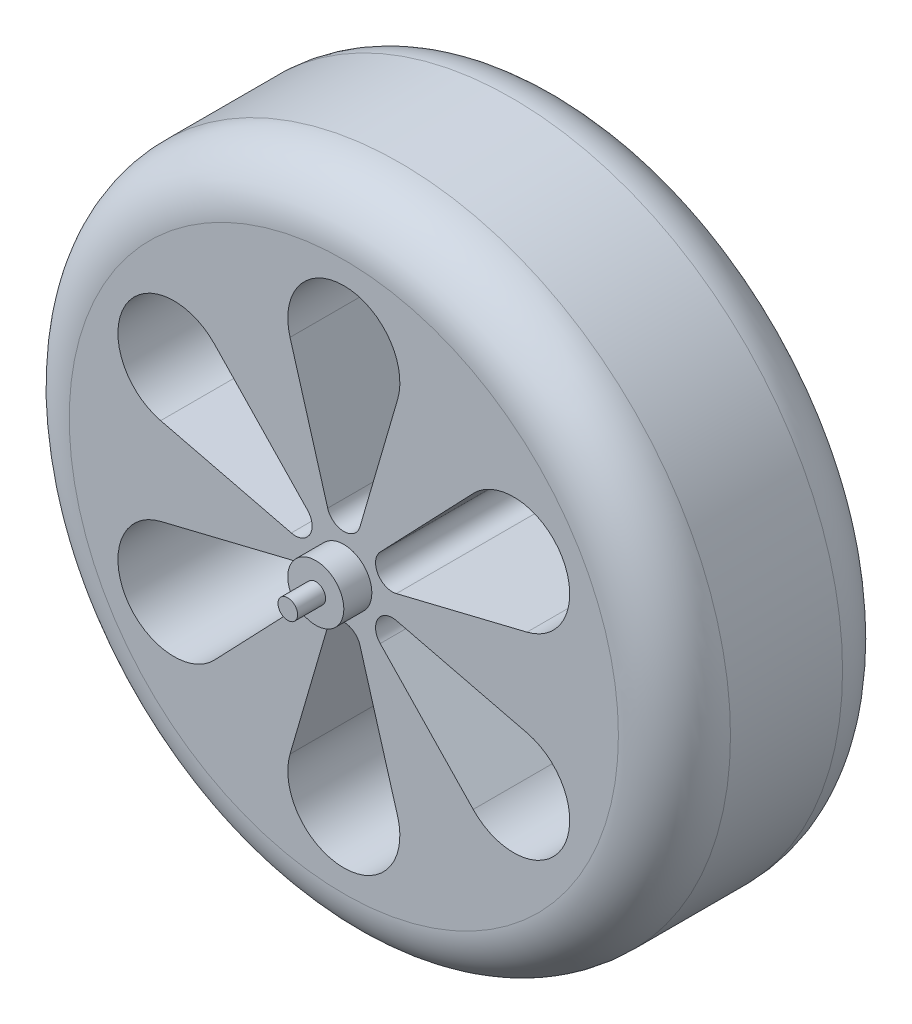
ISO-10303-21;
HEADER;
FILE_DESCRIPTION(('STEP AP214'),'2;1');
FILE_NAME('part.step','',(''),(''),'','','');
FILE_SCHEMA(('AUTOMOTIVE_DESIGN { 1 0 10303 214 1 1 1 1 }'));
ENDSEC;
DATA;
#1=APPLICATION_CONTEXT('core data for automotive mechanical design processes');
#2=APPLICATION_PROTOCOL_DEFINITION('international standard','automotive_design',2000,#1);
#3=PRODUCT_CONTEXT('',#1,'mechanical');
#4=PRODUCT('Part','Part','',(#3));
#5=PRODUCT_RELATED_PRODUCT_CATEGORY('part','',(#4));
#6=PRODUCT_DEFINITION_FORMATION('','',#4);
#7=PRODUCT_DEFINITION_CONTEXT('part definition',#1,'design');
#8=PRODUCT_DEFINITION('design','',#6,#7);
#9=PRODUCT_DEFINITION_SHAPE('','',#8);
#10=(LENGTH_UNIT() NAMED_UNIT(*) SI_UNIT(.MILLI.,.METRE.));
#11=(NAMED_UNIT(*) PLANE_ANGLE_UNIT() SI_UNIT($,.RADIAN.));
#12=(NAMED_UNIT(*) SI_UNIT($,.STERADIAN.) SOLID_ANGLE_UNIT());
#13=UNCERTAINTY_MEASURE_WITH_UNIT(LENGTH_MEASURE(1.E-05),#10,'distance_accuracy_value','');
#14=(GEOMETRIC_REPRESENTATION_CONTEXT(3) GLOBAL_UNCERTAINTY_ASSIGNED_CONTEXT((#13)) GLOBAL_UNIT_ASSIGNED_CONTEXT((#10,
#11,#12)) REPRESENTATION_CONTEXT('',''));
#15=CARTESIAN_POINT('',(0.,0.,0.));
#16=DIRECTION('',(0.,0.,1.));
#17=DIRECTION('',(1.,0.,0.));
#18=AXIS2_PLACEMENT_3D('',#15,#16,#17);
#19=CARTESIAN_POINT('',(0.,0.,40.));
#20=DIRECTION('',(0.,0.,-1.));
#21=DIRECTION('',(-1.,0.,0.));
#22=AXIS2_PLACEMENT_3D('',#19,#20,#21);
#23=CYLINDRICAL_SURFACE('',#22,59.);
#24=CARTESIAN_POINT('',(0.,0.,10.));
#25=DIRECTION('',(0.,0.,1.));
#26=DIRECTION('',(1.,0.,0.));
#27=AXIS2_PLACEMENT_3D('',#24,#25,#26);
#28=CIRCLE('',#27,59.);
#29=CARTESIAN_POINT('',(59.,0.,10.));
#30=VERTEX_POINT('',#29);
#31=EDGE_CURVE('E410',#30,#30,#28,.T.);
#32=ORIENTED_EDGE('',*,*,#31,.T.);
#33=EDGE_LOOP('',(#32));
#34=FACE_BOUND('',#33,.T.);
#35=CARTESIAN_POINT('',(0.,0.,30.));
#36=DIRECTION('',(0.,0.,1.));
#37=DIRECTION('',(1.,0.,0.));
#38=AXIS2_PLACEMENT_3D('',#35,#36,#37);
#39=CIRCLE('',#38,59.);
#40=CARTESIAN_POINT('',(59.,0.,30.));
#41=VERTEX_POINT('',#40);
#42=EDGE_CURVE('E405',#41,#41,#39,.F.);
#43=ORIENTED_EDGE('',*,*,#42,.T.);
#44=EDGE_LOOP('',(#43));
#45=FACE_BOUND('',#44,.T.);
#46=ADVANCED_FACE('F37',(#34,#45),#23,.T.);
#47=CARTESIAN_POINT('',(0.,0.,40.));
#48=DIRECTION('',(0.,0.,1.));
#49=DIRECTION('',(1.,0.,0.));
#50=AXIS2_PLACEMENT_3D('',#47,#48,#49);
#51=PLANE('',#50);
#52=CARTESIAN_POINT('',(30.3108891324552,17.5000000000004,40.));
#53=DIRECTION('',(0.,0.,1.));
#54=DIRECTION('',(0.50000000000001,-0.866025403784433,0.));
#55=AXIS2_PLACEMENT_3D('',#52,#53,#54);
#56=CIRCLE('',#55,10.);
#57=CARTESIAN_POINT('',(32.6860180018588,7.78615612366978,40.));
#58=VERTEX_POINT('',#57);
#59=CARTESIAN_POINT('',(23.0860180018586,24.4138438763309,40.));
#60=VERTEX_POINT('',#59);
#61=EDGE_CURVE('E52',#58,#60,#56,.T.);
#62=ORIENTED_EDGE('',*,*,#61,.F.);
#63=DIRECTION('',(0.971384387633058,0.237512886940369,0.));
#64=VECTOR('',#63,1.);
#65=CARTESIAN_POINT('',(32.6860180018588,7.78615612366978,40.));
#66=LINE('',#65,#64);
#67=CARTESIAN_POINT('',(9.37279269866543,2.08584683710093,40.));
#68=VERTEX_POINT('',#67);
#69=EDGE_CURVE('E243',#68,#58,#66,.T.);
#70=ORIENTED_EDGE('',*,*,#69,.F.);
#71=CARTESIAN_POINT('',(8.66025403784433,5.0000000000001,40.));
#72=DIRECTION('',(0.,0.,1.));
#73=DIRECTION('',(0.50000000000001,-0.866025403784433,0.));
#74=AXIS2_PLACEMENT_3D('',#71,#72,#73);
#75=CIRCLE('',#74,3.);
#76=CARTESIAN_POINT('',(6.49279269866538,7.07415316289926,40.));
#77=VERTEX_POINT('',#76);
#78=EDGE_CURVE('E257',#77,#68,#75,.T.);
#79=ORIENTED_EDGE('',*,*,#78,.F.);
#80=DIRECTION('',(-0.691384387633053,-0.722487113059651,0.));
#81=VECTOR('',#80,1.);
#82=CARTESIAN_POINT('',(23.0860180018586,24.4138438763309,40.));
#83=LINE('',#82,#81);
#84=EDGE_CURVE('E254',#60,#77,#83,.T.);
#85=ORIENTED_EDGE('',*,*,#84,.F.);
#86=EDGE_LOOP('',(#62,#70,#79,#85));
#87=FACE_BOUND('',#86,.T.);
#88=CARTESIAN_POINT('',(30.3108891324555,-17.4999999999997,40.));
#89=DIRECTION('',(0.,0.,1.));
#90=DIRECTION('',(-0.499999999999992,-0.866025403784443,0.));
#91=AXIS2_PLACEMENT_3D('',#88,#89,#90);
#92=CIRCLE('',#91,10.);
#93=CARTESIAN_POINT('',(23.0860180018592,-24.4138438763304,40.));
#94=VERTEX_POINT('',#93);
#95=CARTESIAN_POINT('',(32.686018001859,-7.78615612366909,40.));
#96=VERTEX_POINT('',#95);
#97=EDGE_CURVE('E60',#94,#96,#92,.T.);
#98=ORIENTED_EDGE('',*,*,#97,.F.);
#99=DIRECTION('',(0.691384387633068,-0.722487113059636,0.));
#100=VECTOR('',#99,1.);
#101=CARTESIAN_POINT('',(23.0860180018592,-24.4138438763304,40.));
#102=LINE('',#101,#100);
#103=CARTESIAN_POINT('',(6.49279269866553,-7.07415316289912,40.));
#104=VERTEX_POINT('',#103);
#105=EDGE_CURVE('E219',#104,#94,#102,.T.);
#106=ORIENTED_EDGE('',*,*,#105,.F.);
#107=CARTESIAN_POINT('',(8.66025403784443,-4.99999999999992,40.));
#108=DIRECTION('',(0.,0.,1.));
#109=DIRECTION('',(-0.499999999999992,-0.866025403784443,0.));
#110=AXIS2_PLACEMENT_3D('',#107,#108,#109);
#111=CIRCLE('',#110,3.);
#112=CARTESIAN_POINT('',(9.37279269866548,-2.08584683710073,40.));
#113=VERTEX_POINT('',#112);
#114=EDGE_CURVE('E222',#113,#104,#111,.T.);
#115=ORIENTED_EDGE('',*,*,#114,.F.);
#116=DIRECTION('',(-0.971384387633063,0.237512886940348,0.));
#117=VECTOR('',#116,1.);
#118=CARTESIAN_POINT('',(32.686018001859,-7.78615612366909,40.));
#119=LINE('',#118,#117);
#120=EDGE_CURVE('E228',#96,#113,#119,.T.);
#121=ORIENTED_EDGE('',*,*,#120,.F.);
#122=EDGE_LOOP('',(#98,#106,#115,#121));
#123=FACE_BOUND('',#122,.T.);
#124=CARTESIAN_POINT('',(-30.3108891324553,-17.5000000000001,40.));
#125=DIRECTION('',(0.,0.,1.));
#126=DIRECTION('',(-0.500000000000004,0.866025403784436,0.));
#127=AXIS2_PLACEMENT_3D('',#124,#125,#126);
#128=CIRCLE('',#127,10.);
#129=CARTESIAN_POINT('',(-32.6860180018589,-7.78615612366955,40.));
#130=VERTEX_POINT('',#129);
#131=CARTESIAN_POINT('',(-23.0860180018588,-24.4138438763307,40.));
#132=VERTEX_POINT('',#131);
#133=EDGE_CURVE('E293',#130,#132,#128,.T.);
#134=ORIENTED_EDGE('',*,*,#133,.F.);
#135=DIRECTION('',(-0.97138438763306,-0.237512886940362,0.));
#136=VECTOR('',#135,1.);
#137=CARTESIAN_POINT('',(-32.6860180018589,-7.78615612366955,40.));
#138=LINE('',#137,#136);
#139=CARTESIAN_POINT('',(-9.37279269866545,-2.08584683710086,40.));
#140=VERTEX_POINT('',#139);
#141=EDGE_CURVE('E304',#140,#130,#138,.T.);
#142=ORIENTED_EDGE('',*,*,#141,.F.);
#143=CARTESIAN_POINT('',(-8.66025403784437,-5.00000000000004,40.));
#144=DIRECTION('',(0.,0.,1.));
#145=DIRECTION('',(-0.500000000000004,0.866025403784436,0.));
#146=AXIS2_PLACEMENT_3D('',#143,#144,#145);
#147=CIRCLE('',#146,3.);
#148=CARTESIAN_POINT('',(-6.49279269866543,-7.07415316289921,40.));
#149=VERTEX_POINT('',#148);
#150=EDGE_CURVE('E318',#149,#140,#147,.T.);
#151=ORIENTED_EDGE('',*,*,#150,.F.);
#152=DIRECTION('',(0.691384387633058,0.722487113059646,0.));
#153=VECTOR('',#152,1.);
#154=CARTESIAN_POINT('',(-23.0860180018588,-24.4138438763307,40.));
#155=LINE('',#154,#153);
#156=EDGE_CURVE('E315',#132,#149,#155,.T.);
#157=ORIENTED_EDGE('',*,*,#156,.F.);
#158=EDGE_LOOP('',(#134,#142,#151,#157));
#159=FACE_BOUND('',#158,.T.);
#160=CARTESIAN_POINT('',(0.,-35.,40.));
#161=DIRECTION('',(0.,0.,1.));
#162=DIRECTION('',(-1.,0.,0.));
#163=AXIS2_PLACEMENT_3D('',#160,#161,#162);
#164=CIRCLE('',#163,10.);
#165=CARTESIAN_POINT('',(-9.6,-32.2,40.));
#166=VERTEX_POINT('',#165);
#167=CARTESIAN_POINT('',(9.6,-32.2,40.));
#168=VERTEX_POINT('',#167);
#169=EDGE_CURVE('E235',#166,#168,#164,.T.);
#170=ORIENTED_EDGE('',*,*,#169,.F.);
#171=DIRECTION('',(-0.28,-0.96,0.));
#172=VECTOR('',#171,1.);
#173=CARTESIAN_POINT('',(-9.6,-32.2,40.));
#174=LINE('',#173,#172);
#175=CARTESIAN_POINT('',(-2.88,-9.16,40.));
#176=VERTEX_POINT('',#175);
#177=EDGE_CURVE('E272',#176,#166,#174,.T.);
#178=ORIENTED_EDGE('',*,*,#177,.F.);
#179=CARTESIAN_POINT('',(0.,-10.,40.));
#180=DIRECTION('',(0.,0.,1.));
#181=DIRECTION('',(-1.,0.,0.));
#182=AXIS2_PLACEMENT_3D('',#179,#180,#181);
#183=CIRCLE('',#182,3.);
#184=CARTESIAN_POINT('',(2.88,-9.16,40.));
#185=VERTEX_POINT('',#184);
#186=EDGE_CURVE('E286',#185,#176,#183,.T.);
#187=ORIENTED_EDGE('',*,*,#186,.F.);
#188=DIRECTION('',(-0.28,0.96,0.));
#189=VECTOR('',#188,1.);
#190=CARTESIAN_POINT('',(9.6,-32.2,40.));
#191=LINE('',#190,#189);
#192=EDGE_CURVE('E283',#168,#185,#191,.T.);
#193=ORIENTED_EDGE('',*,*,#192,.F.);
#194=EDGE_LOOP('',(#170,#178,#187,#193));
#195=FACE_BOUND('',#194,.T.);
#196=CARTESIAN_POINT('',(-30.3108891324554,17.4999999999999,40.));
#197=DIRECTION('',(0.,0.,1.));
#198=DIRECTION('',(0.499999999999998,0.86602540378444,0.));
#199=AXIS2_PLACEMENT_3D('',#196,#197,#198);
#200=CIRCLE('',#199,10.);
#201=CARTESIAN_POINT('',(-23.086018001859,24.4138438763306,40.));
#202=VERTEX_POINT('',#201);
#203=CARTESIAN_POINT('',(-32.6860180018589,7.78615612366931,40.));
#204=VERTEX_POINT('',#203);
#205=EDGE_CURVE('E325',#202,#204,#200,.T.);
#206=ORIENTED_EDGE('',*,*,#205,.F.);
#207=DIRECTION('',(-0.691384387633063,0.722487113059641,0.));
#208=VECTOR('',#207,1.);
#209=CARTESIAN_POINT('',(-23.086018001859,24.4138438763306,40.));
#210=LINE('',#209,#208);
#211=CARTESIAN_POINT('',(-6.49279269866548,7.07415316289917,40.));
#212=VERTEX_POINT('',#211);
#213=EDGE_CURVE('E336',#212,#202,#210,.T.);
#214=ORIENTED_EDGE('',*,*,#213,.F.);
#215=CARTESIAN_POINT('',(-8.6602540378444,4.99999999999998,40.));
#216=DIRECTION('',(0.,0.,1.));
#217=DIRECTION('',(0.499999999999998,0.86602540378444,0.));
#218=AXIS2_PLACEMENT_3D('',#215,#216,#217);
#219=CIRCLE('',#218,3.);
#220=CARTESIAN_POINT('',(-9.37279269866546,2.0858468371008,40.));
#221=VERTEX_POINT('',#220);
#222=EDGE_CURVE('E350',#221,#212,#219,.T.);
#223=ORIENTED_EDGE('',*,*,#222,.F.);
#224=DIRECTION('',(0.971384387633062,-0.237512886940355,0.));
#225=VECTOR('',#224,1.);
#226=CARTESIAN_POINT('',(-32.6860180018589,7.78615612366932,40.));
#227=LINE('',#226,#225);
#228=EDGE_CURVE('E347',#204,#221,#227,.T.);
#229=ORIENTED_EDGE('',*,*,#228,.F.);
#230=EDGE_LOOP('',(#206,#214,#223,#229));
#231=FACE_BOUND('',#230,.T.);
#232=CARTESIAN_POINT('',(0.,35.,40.));
#233=DIRECTION('',(0.,0.,1.));
#234=DIRECTION('',(1.,0.,0.));
#235=AXIS2_PLACEMENT_3D('',#232,#233,#234);
#236=CIRCLE('',#235,10.);
#237=CARTESIAN_POINT('',(9.6,32.2,40.));
#238=VERTEX_POINT('',#237);
#239=CARTESIAN_POINT('',(-9.6,32.2,40.));
#240=VERTEX_POINT('',#239);
#241=EDGE_CURVE('E357',#238,#240,#236,.T.);
#242=ORIENTED_EDGE('',*,*,#241,.F.);
#243=DIRECTION('',(0.28,0.96,0.));
#244=VECTOR('',#243,1.);
#245=CARTESIAN_POINT('',(9.6,32.2,40.));
#246=LINE('',#245,#244);
#247=CARTESIAN_POINT('',(2.88,9.16,40.));
#248=VERTEX_POINT('',#247);
#249=EDGE_CURVE('E368',#248,#238,#246,.T.);
#250=ORIENTED_EDGE('',*,*,#249,.F.);
#251=CARTESIAN_POINT('',(0.,10.,40.));
#252=DIRECTION('',(0.,0.,1.));
#253=DIRECTION('',(1.,0.,0.));
#254=AXIS2_PLACEMENT_3D('',#251,#252,#253);
#255=CIRCLE('',#254,3.);
#256=CARTESIAN_POINT('',(-2.88,9.16,40.));
#257=VERTEX_POINT('',#256);
#258=EDGE_CURVE('E382',#257,#248,#255,.T.);
#259=ORIENTED_EDGE('',*,*,#258,.F.);
#260=DIRECTION('',(0.28,-0.96,0.));
#261=VECTOR('',#260,1.);
#262=CARTESIAN_POINT('',(-9.6,32.2,40.));
#263=LINE('',#262,#261);
#264=EDGE_CURVE('E379',#240,#257,#263,.T.);
#265=ORIENTED_EDGE('',*,*,#264,.F.);
#266=EDGE_LOOP('',(#242,#250,#259,#265));
#267=FACE_BOUND('',#266,.T.);
#268=CARTESIAN_POINT('',(0.,0.,40.));
#269=DIRECTION('',(0.,0.,1.));
#270=DIRECTION('',(1.,0.,0.));
#271=AXIS2_PLACEMENT_3D('',#268,#269,#270);
#272=CIRCLE('',#271,5.);
#273=CARTESIAN_POINT('',(5.,0.,40.));
#274=VERTEX_POINT('',#273);
#275=EDGE_CURVE('E399',#274,#274,#272,.T.);
#276=ORIENTED_EDGE('',*,*,#275,.F.);
#277=EDGE_LOOP('',(#276));
#278=FACE_BOUND('',#277,.T.);
#279=CARTESIAN_POINT('',(0.,0.,40.));
#280=DIRECTION('',(0.,0.,1.));
#281=DIRECTION('',(1.,0.,0.));
#282=AXIS2_PLACEMENT_3D('',#279,#280,#281);
#283=CIRCLE('',#282,49.);
#284=CARTESIAN_POINT('',(49.,0.,40.));
#285=VERTEX_POINT('',#284);
#286=EDGE_CURVE('E11',#285,#285,#283,.T.);
#287=ORIENTED_EDGE('',*,*,#286,.T.);
#288=EDGE_LOOP('',(#287));
#289=FACE_BOUND('',#288,.T.);
#290=ADVANCED_FACE('F423',(#87,#123,#159,#195,#231,#267,#278,#289),#51,.T.);
#291=CARTESIAN_POINT('',(0.,0.,0.));
#292=DIRECTION('',(0.,0.,1.));
#293=DIRECTION('',(1.,0.,0.));
#294=AXIS2_PLACEMENT_3D('',#291,#292,#293);
#295=PLANE('',#294);
#296=DIRECTION('',(0.971384387633058,0.237512886940369,0.));
#297=VECTOR('',#296,1.);
#298=CARTESIAN_POINT('',(32.6860180018588,7.78615612366978,0.));
#299=LINE('',#298,#297);
#300=CARTESIAN_POINT('',(9.37279269866543,2.08584683710093,0.));
#301=VERTEX_POINT('',#300);
#302=CARTESIAN_POINT('',(32.6860180018588,7.78615612366978,0.));
#303=VERTEX_POINT('',#302);
#304=EDGE_CURVE('E249',#301,#303,#299,.T.);
#305=ORIENTED_EDGE('',*,*,#304,.T.);
#306=CARTESIAN_POINT('',(30.3108891324552,17.5000000000004,0.));
#307=DIRECTION('',(0.,0.,1.));
#308=DIRECTION('',(0.50000000000001,-0.866025403784433,0.));
#309=AXIS2_PLACEMENT_3D('',#306,#307,#308);
#310=CIRCLE('',#309,10.);
#311=CARTESIAN_POINT('',(23.0860180018586,24.4138438763309,0.));
#312=VERTEX_POINT('',#311);
#313=EDGE_CURVE('E239',#303,#312,#310,.T.);
#314=ORIENTED_EDGE('',*,*,#313,.T.);
#315=DIRECTION('',(-0.691384387633053,-0.722487113059651,0.));
#316=VECTOR('',#315,1.);
#317=CARTESIAN_POINT('',(23.0860180018586,24.4138438763309,0.));
#318=LINE('',#317,#316);
#319=CARTESIAN_POINT('',(6.49279269866538,7.07415316289926,0.));
#320=VERTEX_POINT('',#319);
#321=EDGE_CURVE('E242',#312,#320,#318,.T.);
#322=ORIENTED_EDGE('',*,*,#321,.T.);
#323=CARTESIAN_POINT('',(8.66025403784433,5.0000000000001,0.));
#324=DIRECTION('',(0.,0.,1.));
#325=DIRECTION('',(0.50000000000001,-0.866025403784433,0.));
#326=AXIS2_PLACEMENT_3D('',#323,#324,#325);
#327=CIRCLE('',#326,3.);
#328=EDGE_CURVE('E246',#320,#301,#327,.T.);
#329=ORIENTED_EDGE('',*,*,#328,.T.);
#330=EDGE_LOOP('',(#305,#314,#322,#329));
#331=FACE_BOUND('',#330,.T.);
#332=DIRECTION('',(0.691384387633068,-0.722487113059636,0.));
#333=VECTOR('',#332,1.);
#334=CARTESIAN_POINT('',(23.0860180018592,-24.4138438763304,0.));
#335=LINE('',#334,#333);
#336=CARTESIAN_POINT('',(6.49279269866553,-7.07415316289912,0.));
#337=VERTEX_POINT('',#336);
#338=CARTESIAN_POINT('',(23.0860180018592,-24.4138438763304,0.));
#339=VERTEX_POINT('',#338);
#340=EDGE_CURVE('E206',#337,#339,#335,.T.);
#341=ORIENTED_EDGE('',*,*,#340,.T.);
#342=CARTESIAN_POINT('',(30.3108891324555,-17.4999999999997,0.));
#343=DIRECTION('',(0.,0.,1.));
#344=DIRECTION('',(-0.499999999999992,-0.866025403784443,0.));
#345=AXIS2_PLACEMENT_3D('',#342,#343,#344);
#346=CIRCLE('',#345,10.);
#347=CARTESIAN_POINT('',(32.686018001859,-7.78615612366909,0.));
#348=VERTEX_POINT('',#347);
#349=EDGE_CURVE('E200',#339,#348,#346,.T.);
#350=ORIENTED_EDGE('',*,*,#349,.T.);
#351=DIRECTION('',(-0.971384387633063,0.237512886940348,0.));
#352=VECTOR('',#351,1.);
#353=CARTESIAN_POINT('',(32.686018001859,-7.78615612366909,0.));
#354=LINE('',#353,#352);
#355=CARTESIAN_POINT('',(9.37279269866548,-2.08584683710073,0.));
#356=VERTEX_POINT('',#355);
#357=EDGE_CURVE('E210',#348,#356,#354,.T.);
#358=ORIENTED_EDGE('',*,*,#357,.T.);
#359=CARTESIAN_POINT('',(8.66025403784443,-4.99999999999992,0.));
#360=DIRECTION('',(0.,0.,1.));
#361=DIRECTION('',(-0.499999999999992,-0.866025403784443,0.));
#362=AXIS2_PLACEMENT_3D('',#359,#360,#361);
#363=CIRCLE('',#362,3.);
#364=EDGE_CURVE('E214',#356,#337,#363,.T.);
#365=ORIENTED_EDGE('',*,*,#364,.T.);
#366=EDGE_LOOP('',(#341,#350,#358,#365));
#367=FACE_BOUND('',#366,.T.);
#368=DIRECTION('',(-0.97138438763306,-0.237512886940362,0.));
#369=VECTOR('',#368,1.);
#370=CARTESIAN_POINT('',(-32.6860180018589,-7.78615612366955,0.));
#371=LINE('',#370,#369);
#372=CARTESIAN_POINT('',(-9.37279269866545,-2.08584683710086,0.));
#373=VERTEX_POINT('',#372);
#374=CARTESIAN_POINT('',(-32.6860180018589,-7.78615612366955,0.));
#375=VERTEX_POINT('',#374);
#376=EDGE_CURVE('E310',#373,#375,#371,.T.);
#377=ORIENTED_EDGE('',*,*,#376,.T.);
#378=CARTESIAN_POINT('',(-30.3108891324553,-17.5000000000001,0.));
#379=DIRECTION('',(0.,0.,1.));
#380=DIRECTION('',(-0.500000000000004,0.866025403784436,0.));
#381=AXIS2_PLACEMENT_3D('',#378,#379,#380);
#382=CIRCLE('',#381,10.);
#383=CARTESIAN_POINT('',(-23.0860180018588,-24.4138438763307,0.));
#384=VERTEX_POINT('',#383);
#385=EDGE_CURVE('E300',#375,#384,#382,.T.);
#386=ORIENTED_EDGE('',*,*,#385,.T.);
#387=DIRECTION('',(0.691384387633058,0.722487113059646,0.));
#388=VECTOR('',#387,1.);
#389=CARTESIAN_POINT('',(-23.0860180018588,-24.4138438763307,0.));
#390=LINE('',#389,#388);
#391=CARTESIAN_POINT('',(-6.49279269866543,-7.07415316289921,0.));
#392=VERTEX_POINT('',#391);
#393=EDGE_CURVE('E303',#384,#392,#390,.T.);
#394=ORIENTED_EDGE('',*,*,#393,.T.);
#395=CARTESIAN_POINT('',(-8.66025403784437,-5.00000000000004,0.));
#396=DIRECTION('',(0.,0.,1.));
#397=DIRECTION('',(-0.500000000000004,0.866025403784436,0.));
#398=AXIS2_PLACEMENT_3D('',#395,#396,#397);
#399=CIRCLE('',#398,3.);
#400=EDGE_CURVE('E307',#392,#373,#399,.T.);
#401=ORIENTED_EDGE('',*,*,#400,.T.);
#402=EDGE_LOOP('',(#377,#386,#394,#401));
#403=FACE_BOUND('',#402,.T.);
#404=DIRECTION('',(-0.28,-0.96,0.));
#405=VECTOR('',#404,1.);
#406=CARTESIAN_POINT('',(-9.6,-32.2,0.));
#407=LINE('',#406,#405);
#408=CARTESIAN_POINT('',(-2.88,-9.16,0.));
#409=VERTEX_POINT('',#408);
#410=CARTESIAN_POINT('',(-9.6,-32.2,0.));
#411=VERTEX_POINT('',#410);
#412=EDGE_CURVE('E278',#409,#411,#407,.T.);
#413=ORIENTED_EDGE('',*,*,#412,.T.);
#414=CARTESIAN_POINT('',(0.,-35.,0.));
#415=DIRECTION('',(0.,0.,1.));
#416=DIRECTION('',(-1.,0.,0.));
#417=AXIS2_PLACEMENT_3D('',#414,#415,#416);
#418=CIRCLE('',#417,10.);
#419=CARTESIAN_POINT('',(9.6,-32.2,0.));
#420=VERTEX_POINT('',#419);
#421=EDGE_CURVE('E268',#411,#420,#418,.T.);
#422=ORIENTED_EDGE('',*,*,#421,.T.);
#423=DIRECTION('',(-0.28,0.96,0.));
#424=VECTOR('',#423,1.);
#425=CARTESIAN_POINT('',(9.6,-32.2,0.));
#426=LINE('',#425,#424);
#427=CARTESIAN_POINT('',(2.88,-9.16,0.));
#428=VERTEX_POINT('',#427);
#429=EDGE_CURVE('E271',#420,#428,#426,.T.);
#430=ORIENTED_EDGE('',*,*,#429,.T.);
#431=CARTESIAN_POINT('',(0.,-10.,0.));
#432=DIRECTION('',(0.,0.,1.));
#433=DIRECTION('',(-1.,0.,0.));
#434=AXIS2_PLACEMENT_3D('',#431,#432,#433);
#435=CIRCLE('',#434,3.);
#436=EDGE_CURVE('E275',#428,#409,#435,.T.);
#437=ORIENTED_EDGE('',*,*,#436,.T.);
#438=EDGE_LOOP('',(#413,#422,#430,#437));
#439=FACE_BOUND('',#438,.T.);
#440=DIRECTION('',(-0.691384387633063,0.722487113059641,0.));
#441=VECTOR('',#440,1.);
#442=CARTESIAN_POINT('',(-23.086018001859,24.4138438763306,0.));
#443=LINE('',#442,#441);
#444=CARTESIAN_POINT('',(-6.49279269866548,7.07415316289917,0.));
#445=VERTEX_POINT('',#444);
#446=CARTESIAN_POINT('',(-23.086018001859,24.4138438763306,0.));
#447=VERTEX_POINT('',#446);
#448=EDGE_CURVE('E342',#445,#447,#443,.T.);
#449=ORIENTED_EDGE('',*,*,#448,.T.);
#450=CARTESIAN_POINT('',(-30.3108891324554,17.4999999999999,0.));
#451=DIRECTION('',(0.,0.,1.));
#452=DIRECTION('',(0.499999999999998,0.86602540378444,0.));
#453=AXIS2_PLACEMENT_3D('',#450,#451,#452);
#454=CIRCLE('',#453,10.);
#455=CARTESIAN_POINT('',(-32.6860180018589,7.78615612366932,0.));
#456=VERTEX_POINT('',#455);
#457=EDGE_CURVE('E332',#447,#456,#454,.T.);
#458=ORIENTED_EDGE('',*,*,#457,.T.);
#459=DIRECTION('',(0.971384387633062,-0.237512886940355,0.));
#460=VECTOR('',#459,1.);
#461=CARTESIAN_POINT('',(-32.6860180018589,7.78615612366932,0.));
#462=LINE('',#461,#460);
#463=CARTESIAN_POINT('',(-9.37279269866546,2.0858468371008,0.));
#464=VERTEX_POINT('',#463);
#465=EDGE_CURVE('E335',#456,#464,#462,.T.);
#466=ORIENTED_EDGE('',*,*,#465,.T.);
#467=CARTESIAN_POINT('',(-8.6602540378444,4.99999999999998,0.));
#468=DIRECTION('',(0.,0.,1.));
#469=DIRECTION('',(0.499999999999998,0.86602540378444,0.));
#470=AXIS2_PLACEMENT_3D('',#467,#468,#469);
#471=CIRCLE('',#470,3.);
#472=EDGE_CURVE('E339',#464,#445,#471,.T.);
#473=ORIENTED_EDGE('',*,*,#472,.T.);
#474=EDGE_LOOP('',(#449,#458,#466,#473));
#475=FACE_BOUND('',#474,.T.);
#476=DIRECTION('',(0.28,0.96,0.));
#477=VECTOR('',#476,1.);
#478=CARTESIAN_POINT('',(9.6,32.2,0.));
#479=LINE('',#478,#477);
#480=CARTESIAN_POINT('',(2.88,9.16,0.));
#481=VERTEX_POINT('',#480);
#482=CARTESIAN_POINT('',(9.6,32.2,0.));
#483=VERTEX_POINT('',#482);
#484=EDGE_CURVE('E374',#481,#483,#479,.T.);
#485=ORIENTED_EDGE('',*,*,#484,.T.);
#486=CARTESIAN_POINT('',(0.,35.,0.));
#487=DIRECTION('',(0.,0.,1.));
#488=DIRECTION('',(1.,0.,0.));
#489=AXIS2_PLACEMENT_3D('',#486,#487,#488);
#490=CIRCLE('',#489,10.);
#491=CARTESIAN_POINT('',(-9.6,32.2,0.));
#492=VERTEX_POINT('',#491);
#493=EDGE_CURVE('E364',#483,#492,#490,.T.);
#494=ORIENTED_EDGE('',*,*,#493,.T.);
#495=DIRECTION('',(0.28,-0.96,0.));
#496=VECTOR('',#495,1.);
#497=CARTESIAN_POINT('',(-9.6,32.2,0.));
#498=LINE('',#497,#496);
#499=CARTESIAN_POINT('',(-2.88,9.16,0.));
#500=VERTEX_POINT('',#499);
#501=EDGE_CURVE('E367',#492,#500,#498,.T.);
#502=ORIENTED_EDGE('',*,*,#501,.T.);
#503=CARTESIAN_POINT('',(0.,10.,0.));
#504=DIRECTION('',(0.,0.,1.));
#505=DIRECTION('',(1.,0.,0.));
#506=AXIS2_PLACEMENT_3D('',#503,#504,#505);
#507=CIRCLE('',#506,3.);
#508=EDGE_CURVE('E371',#500,#481,#507,.T.);
#509=ORIENTED_EDGE('',*,*,#508,.T.);
#510=EDGE_LOOP('',(#485,#494,#502,#509));
#511=FACE_BOUND('',#510,.T.);
#512=CARTESIAN_POINT('',(0.,0.,0.));
#513=DIRECTION('',(0.,0.,1.));
#514=DIRECTION('',(1.,0.,0.));
#515=AXIS2_PLACEMENT_3D('',#512,#513,#514);
#516=CIRCLE('',#515,49.);
#517=CARTESIAN_POINT('',(49.,0.,0.));
#518=VERTEX_POINT('',#517);
#519=EDGE_CURVE('E45',#518,#518,#516,.F.);
#520=ORIENTED_EDGE('',*,*,#519,.T.);
#521=EDGE_LOOP('',(#520));
#522=FACE_BOUND('',#521,.T.);
#523=ADVANCED_FACE('F216',(#331,#367,#403,#439,#475,#511,#522),#295,.F.);
#524=CARTESIAN_POINT('',(0.,0.,10.));
#525=DIRECTION('',(0.,0.,1.));
#526=DIRECTION('',(1.,0.,0.));
#527=AXIS2_PLACEMENT_3D('',#524,#525,#526);
#528=TOROIDAL_SURFACE('',#527,49.,10.);
#529=ORIENTED_EDGE('',*,*,#519,.F.);
#530=EDGE_LOOP('',(#529));
#531=FACE_BOUND('',#530,.T.);
#532=ORIENTED_EDGE('',*,*,#31,.F.);
#533=EDGE_LOOP('',(#532));
#534=FACE_BOUND('',#533,.T.);
#535=ADVANCED_FACE('F416',(#531,#534),#528,.T.);
#536=CARTESIAN_POINT('',(0.,0.,30.));
#537=DIRECTION('',(0.,0.,1.));
#538=DIRECTION('',(1.,0.,0.));
#539=AXIS2_PLACEMENT_3D('',#536,#537,#538);
#540=TOROIDAL_SURFACE('',#539,49.,10.);
#541=ORIENTED_EDGE('',*,*,#42,.F.);
#542=EDGE_LOOP('',(#541));
#543=FACE_BOUND('',#542,.T.);
#544=ORIENTED_EDGE('',*,*,#286,.F.);
#545=EDGE_LOOP('',(#544));
#546=FACE_BOUND('',#545,.T.);
#547=ADVANCED_FACE('F39',(#543,#546),#540,.T.);
#548=CARTESIAN_POINT('',(0.,0.,45.));
#549=DIRECTION('',(0.,0.,-1.));
#550=DIRECTION('',(-1.,0.,0.));
#551=AXIS2_PLACEMENT_3D('',#548,#549,#550);
#552=CYLINDRICAL_SURFACE('',#551,5.);
#553=CARTESIAN_POINT('',(0.,0.,45.));
#554=DIRECTION('',(0.,0.,1.));
#555=DIRECTION('',(1.,0.,0.));
#556=AXIS2_PLACEMENT_3D('',#553,#554,#555);
#557=CIRCLE('',#556,5.);
#558=CARTESIAN_POINT('',(5.,0.,45.));
#559=VERTEX_POINT('',#558);
#560=EDGE_CURVE('E402',#559,#559,#557,.T.);
#561=ORIENTED_EDGE('',*,*,#560,.F.);
#562=EDGE_LOOP('',(#561));
#563=FACE_BOUND('',#562,.T.);
#564=ORIENTED_EDGE('',*,*,#275,.T.);
#565=EDGE_LOOP('',(#564));
#566=FACE_BOUND('',#565,.T.);
#567=ADVANCED_FACE('F429',(#563,#566),#552,.T.);
#568=CARTESIAN_POINT('',(0.,0.,45.));
#569=DIRECTION('',(0.,0.,1.));
#570=DIRECTION('',(1.,0.,0.));
#571=AXIS2_PLACEMENT_3D('',#568,#569,#570);
#572=PLANE('',#571);
#573=CARTESIAN_POINT('',(0.,0.,45.));
#574=DIRECTION('',(0.,0.,1.));
#575=DIRECTION('',(1.,0.,0.));
#576=AXIS2_PLACEMENT_3D('',#573,#574,#575);
#577=CIRCLE('',#576,1.75);
#578=CARTESIAN_POINT('',(1.75,0.,45.));
#579=VERTEX_POINT('',#578);
#580=EDGE_CURVE('E389',#579,#579,#577,.T.);
#581=ORIENTED_EDGE('',*,*,#580,.F.);
#582=EDGE_LOOP('',(#581));
#583=FACE_BOUND('',#582,.T.);
#584=ORIENTED_EDGE('',*,*,#560,.T.);
#585=EDGE_LOOP('',(#584));
#586=FACE_BOUND('',#585,.T.);
#587=ADVANCED_FACE('F444',(#583,#586),#572,.T.);
#588=CARTESIAN_POINT('',(0.,0.,50.));
#589=DIRECTION('',(0.,0.,-1.));
#590=DIRECTION('',(-1.,0.,0.));
#591=AXIS2_PLACEMENT_3D('',#588,#589,#590);
#592=CYLINDRICAL_SURFACE('',#591,1.75);
#593=CARTESIAN_POINT('',(0.,0.,50.));
#594=DIRECTION('',(0.,0.,1.));
#595=DIRECTION('',(1.,0.,0.));
#596=AXIS2_PLACEMENT_3D('',#593,#594,#595);
#597=CIRCLE('',#596,1.75);
#598=CARTESIAN_POINT('',(1.75,0.,50.));
#599=VERTEX_POINT('',#598);
#600=EDGE_CURVE('E396',#599,#599,#597,.T.);
#601=ORIENTED_EDGE('',*,*,#600,.F.);
#602=EDGE_LOOP('',(#601));
#603=FACE_BOUND('',#602,.T.);
#604=ORIENTED_EDGE('',*,*,#580,.T.);
#605=EDGE_LOOP('',(#604));
#606=FACE_BOUND('',#605,.T.);
#607=ADVANCED_FACE('F448',(#603,#606),#592,.T.);
#608=CARTESIAN_POINT('',(0.,0.,50.));
#609=DIRECTION('',(0.,0.,1.));
#610=DIRECTION('',(1.,0.,0.));
#611=AXIS2_PLACEMENT_3D('',#608,#609,#610);
#612=PLANE('',#611);
#613=ORIENTED_EDGE('',*,*,#600,.T.);
#614=EDGE_LOOP('',(#613));
#615=FACE_BOUND('',#614,.T.);
#616=ADVANCED_FACE('F452',(#615),#612,.T.);
#617=CARTESIAN_POINT('',(0.,35.,0.));
#618=DIRECTION('',(0.,0.,1.));
#619=DIRECTION('',(1.,0.,0.));
#620=AXIS2_PLACEMENT_3D('',#617,#618,#619);
#621=CYLINDRICAL_SURFACE('',#620,10.);
#622=ORIENTED_EDGE('',*,*,#241,.T.);
#623=DIRECTION('',(0.,0.,1.));
#624=VECTOR('',#623,1.);
#625=CARTESIAN_POINT('',(-9.6,32.2,0.));
#626=LINE('',#625,#624);
#627=EDGE_CURVE('E377',#492,#240,#626,.T.);
#628=ORIENTED_EDGE('',*,*,#627,.F.);
#629=ORIENTED_EDGE('',*,*,#493,.F.);
#630=DIRECTION('',(0.,0.,1.));
#631=VECTOR('',#630,1.);
#632=CARTESIAN_POINT('',(9.6,32.2,0.));
#633=LINE('',#632,#631);
#634=EDGE_CURVE('E387',#483,#238,#633,.T.);
#635=ORIENTED_EDGE('',*,*,#634,.T.);
#636=EDGE_LOOP('',(#622,#628,#629,#635));
#637=FACE_BOUND('',#636,.T.);
#638=ADVANCED_FACE('F456',(#637),#621,.F.);
#639=CARTESIAN_POINT('',(9.6,32.2,0.));
#640=DIRECTION('',(0.96,-0.28,0.));
#641=DIRECTION('',(0.28,0.96,0.));
#642=AXIS2_PLACEMENT_3D('',#639,#640,#641);
#643=PLANE('',#642);
#644=ORIENTED_EDGE('',*,*,#249,.T.);
#645=ORIENTED_EDGE('',*,*,#634,.F.);
#646=ORIENTED_EDGE('',*,*,#484,.F.);
#647=DIRECTION('',(0.,0.,1.));
#648=VECTOR('',#647,1.);
#649=CARTESIAN_POINT('',(2.88,9.16,0.));
#650=LINE('',#649,#648);
#651=EDGE_CURVE('E390',#481,#248,#650,.T.);
#652=ORIENTED_EDGE('',*,*,#651,.T.);
#653=EDGE_LOOP('',(#644,#645,#646,#652));
#654=FACE_BOUND('',#653,.T.);
#655=ADVANCED_FACE('F460',(#654),#643,.F.);
#656=CARTESIAN_POINT('',(0.,10.,0.));
#657=DIRECTION('',(0.,0.,1.));
#658=DIRECTION('',(1.,0.,0.));
#659=AXIS2_PLACEMENT_3D('',#656,#657,#658);
#660=CYLINDRICAL_SURFACE('',#659,3.);
#661=ORIENTED_EDGE('',*,*,#258,.T.);
#662=ORIENTED_EDGE('',*,*,#651,.F.);
#663=ORIENTED_EDGE('',*,*,#508,.F.);
#664=DIRECTION('',(0.,0.,1.));
#665=VECTOR('',#664,1.);
#666=CARTESIAN_POINT('',(-2.88,9.16,0.));
#667=LINE('',#666,#665);
#668=EDGE_CURVE('E392',#500,#257,#667,.T.);
#669=ORIENTED_EDGE('',*,*,#668,.T.);
#670=EDGE_LOOP('',(#661,#662,#663,#669));
#671=FACE_BOUND('',#670,.T.);
#672=ADVANCED_FACE('F466',(#671),#660,.F.);
#673=CARTESIAN_POINT('',(-9.6,32.2,0.));
#674=DIRECTION('',(-0.96,-0.28,0.));
#675=DIRECTION('',(0.28,-0.96,0.));
#676=AXIS2_PLACEMENT_3D('',#673,#674,#675);
#677=PLANE('',#676);
#678=ORIENTED_EDGE('',*,*,#264,.T.);
#679=ORIENTED_EDGE('',*,*,#668,.F.);
#680=ORIENTED_EDGE('',*,*,#501,.F.);
#681=ORIENTED_EDGE('',*,*,#627,.T.);
#682=EDGE_LOOP('',(#678,#679,#680,#681));
#683=FACE_BOUND('',#682,.T.);
#684=ADVANCED_FACE('F462',(#683),#677,.F.);
#685=CARTESIAN_POINT('',(-30.3108891324554,17.4999999999999,0.));
#686=DIRECTION('',(0.,0.,1.));
#687=DIRECTION('',(1.,0.,0.));
#688=AXIS2_PLACEMENT_3D('',#685,#686,#687);
#689=CYLINDRICAL_SURFACE('',#688,10.);
#690=ORIENTED_EDGE('',*,*,#205,.T.);
#691=DIRECTION('',(0.,0.,1.));
#692=VECTOR('',#691,1.);
#693=CARTESIAN_POINT('',(-32.6860180018589,7.78615612366932,0.));
#694=LINE('',#693,#692);
#695=EDGE_CURVE('E345',#456,#204,#694,.T.);
#696=ORIENTED_EDGE('',*,*,#695,.F.);
#697=ORIENTED_EDGE('',*,*,#457,.F.);
#698=DIRECTION('',(0.,0.,1.));
#699=VECTOR('',#698,1.);
#700=CARTESIAN_POINT('',(-23.086018001859,24.4138438763306,0.));
#701=LINE('',#700,#699);
#702=EDGE_CURVE('E355',#447,#202,#701,.T.);
#703=ORIENTED_EDGE('',*,*,#702,.T.);
#704=EDGE_LOOP('',(#690,#696,#697,#703));
#705=FACE_BOUND('',#704,.T.);
#706=ADVANCED_FACE('F465',(#705),#689,.F.);
#707=CARTESIAN_POINT('',(-23.086018001859,24.4138438763306,0.));
#708=DIRECTION('',(0.722487113059641,0.691384387633063,0.));
#709=DIRECTION('',(-0.691384387633063,0.722487113059641,0.));
#710=AXIS2_PLACEMENT_3D('',#707,#708,#709);
#711=PLANE('',#710);
#712=ORIENTED_EDGE('',*,*,#213,.T.);
#713=ORIENTED_EDGE('',*,*,#702,.F.);
#714=ORIENTED_EDGE('',*,*,#448,.F.);
#715=DIRECTION('',(0.,0.,1.));
#716=VECTOR('',#715,1.);
#717=CARTESIAN_POINT('',(-6.49279269866548,7.07415316289917,0.));
#718=LINE('',#717,#716);
#719=EDGE_CURVE('E358',#445,#212,#718,.T.);
#720=ORIENTED_EDGE('',*,*,#719,.T.);
#721=EDGE_LOOP('',(#712,#713,#714,#720));
#722=FACE_BOUND('',#721,.T.);
#723=ADVANCED_FACE('F476',(#722),#711,.F.);
#724=CARTESIAN_POINT('',(-8.6602540378444,4.99999999999998,0.));
#725=DIRECTION('',(0.,0.,1.));
#726=DIRECTION('',(1.,0.,0.));
#727=AXIS2_PLACEMENT_3D('',#724,#725,#726);
#728=CYLINDRICAL_SURFACE('',#727,3.);
#729=ORIENTED_EDGE('',*,*,#222,.T.);
#730=ORIENTED_EDGE('',*,*,#719,.F.);
#731=ORIENTED_EDGE('',*,*,#472,.F.);
#732=DIRECTION('',(0.,0.,1.));
#733=VECTOR('',#732,1.);
#734=CARTESIAN_POINT('',(-9.37279269866546,2.0858468371008,0.));
#735=LINE('',#734,#733);
#736=EDGE_CURVE('E360',#464,#221,#735,.T.);
#737=ORIENTED_EDGE('',*,*,#736,.T.);
#738=EDGE_LOOP('',(#729,#730,#731,#737));
#739=FACE_BOUND('',#738,.T.);
#740=ADVANCED_FACE('F482',(#739),#728,.F.);
#741=CARTESIAN_POINT('',(-32.6860180018589,7.78615612366932,0.));
#742=DIRECTION('',(-0.237512886940355,-0.971384387633062,0.));
#743=DIRECTION('',(0.971384387633062,-0.237512886940355,0.));
#744=AXIS2_PLACEMENT_3D('',#741,#742,#743);
#745=PLANE('',#744);
#746=ORIENTED_EDGE('',*,*,#228,.T.);
#747=ORIENTED_EDGE('',*,*,#736,.F.);
#748=ORIENTED_EDGE('',*,*,#465,.F.);
#749=ORIENTED_EDGE('',*,*,#695,.T.);
#750=EDGE_LOOP('',(#746,#747,#748,#749));
#751=FACE_BOUND('',#750,.T.);
#752=ADVANCED_FACE('F478',(#751),#745,.F.);
#753=CARTESIAN_POINT('',(0.,-35.,0.));
#754=DIRECTION('',(0.,0.,1.));
#755=DIRECTION('',(1.,0.,0.));
#756=AXIS2_PLACEMENT_3D('',#753,#754,#755);
#757=CYLINDRICAL_SURFACE('',#756,10.);
#758=ORIENTED_EDGE('',*,*,#169,.T.);
#759=DIRECTION('',(0.,0.,1.));
#760=VECTOR('',#759,1.);
#761=CARTESIAN_POINT('',(9.6,-32.2,0.));
#762=LINE('',#761,#760);
#763=EDGE_CURVE('E281',#420,#168,#762,.T.);
#764=ORIENTED_EDGE('',*,*,#763,.F.);
#765=ORIENTED_EDGE('',*,*,#421,.F.);
#766=DIRECTION('',(0.,0.,1.));
#767=VECTOR('',#766,1.);
#768=CARTESIAN_POINT('',(-9.6,-32.2,0.));
#769=LINE('',#768,#767);
#770=EDGE_CURVE('E291',#411,#166,#769,.T.);
#771=ORIENTED_EDGE('',*,*,#770,.T.);
#772=EDGE_LOOP('',(#758,#764,#765,#771));
#773=FACE_BOUND('',#772,.T.);
#774=ADVANCED_FACE('F481',(#773),#757,.F.);
#775=CARTESIAN_POINT('',(-9.6,-32.2,0.));
#776=DIRECTION('',(-0.96,0.28,0.));
#777=DIRECTION('',(-0.28,-0.96,0.));
#778=AXIS2_PLACEMENT_3D('',#775,#776,#777);
#779=PLANE('',#778);
#780=ORIENTED_EDGE('',*,*,#177,.T.);
#781=ORIENTED_EDGE('',*,*,#770,.F.);
#782=ORIENTED_EDGE('',*,*,#412,.F.);
#783=DIRECTION('',(0.,0.,1.));
#784=VECTOR('',#783,1.);
#785=CARTESIAN_POINT('',(-2.88,-9.16,0.));
#786=LINE('',#785,#784);
#787=EDGE_CURVE('E294',#409,#176,#786,.T.);
#788=ORIENTED_EDGE('',*,*,#787,.T.);
#789=EDGE_LOOP('',(#780,#781,#782,#788));
#790=FACE_BOUND('',#789,.T.);
#791=ADVANCED_FACE('F509',(#790),#779,.F.);
#792=CARTESIAN_POINT('',(0.,-10.,0.));
#793=DIRECTION('',(0.,0.,1.));
#794=DIRECTION('',(1.,0.,0.));
#795=AXIS2_PLACEMENT_3D('',#792,#793,#794);
#796=CYLINDRICAL_SURFACE('',#795,3.);
#797=ORIENTED_EDGE('',*,*,#186,.T.);
#798=ORIENTED_EDGE('',*,*,#787,.F.);
#799=ORIENTED_EDGE('',*,*,#436,.F.);
#800=DIRECTION('',(0.,0.,1.));
#801=VECTOR('',#800,1.);
#802=CARTESIAN_POINT('',(2.88,-9.16,0.));
#803=LINE('',#802,#801);
#804=EDGE_CURVE('E296',#428,#185,#803,.T.);
#805=ORIENTED_EDGE('',*,*,#804,.T.);
#806=EDGE_LOOP('',(#797,#798,#799,#805));
#807=FACE_BOUND('',#806,.T.);
#808=ADVANCED_FACE('F513',(#807),#796,.F.);
#809=CARTESIAN_POINT('',(9.6,-32.2,0.));
#810=DIRECTION('',(0.96,0.28,0.));
#811=DIRECTION('',(-0.28,0.96,0.));
#812=AXIS2_PLACEMENT_3D('',#809,#810,#811);
#813=PLANE('',#812);
#814=ORIENTED_EDGE('',*,*,#192,.T.);
#815=ORIENTED_EDGE('',*,*,#804,.F.);
#816=ORIENTED_EDGE('',*,*,#429,.F.);
#817=ORIENTED_EDGE('',*,*,#763,.T.);
#818=EDGE_LOOP('',(#814,#815,#816,#817));
#819=FACE_BOUND('',#818,.T.);
#820=ADVANCED_FACE('F494',(#819),#813,.F.);
#821=CARTESIAN_POINT('',(-30.3108891324553,-17.5000000000001,0.));
#822=DIRECTION('',(0.,0.,1.));
#823=DIRECTION('',(1.,0.,0.));
#824=AXIS2_PLACEMENT_3D('',#821,#822,#823);
#825=CYLINDRICAL_SURFACE('',#824,10.);
#826=ORIENTED_EDGE('',*,*,#133,.T.);
#827=DIRECTION('',(0.,0.,1.));
#828=VECTOR('',#827,1.);
#829=CARTESIAN_POINT('',(-23.0860180018588,-24.4138438763307,0.));
#830=LINE('',#829,#828);
#831=EDGE_CURVE('E313',#384,#132,#830,.T.);
#832=ORIENTED_EDGE('',*,*,#831,.F.);
#833=ORIENTED_EDGE('',*,*,#385,.F.);
#834=DIRECTION('',(0.,0.,1.));
#835=VECTOR('',#834,1.);
#836=CARTESIAN_POINT('',(-32.6860180018589,-7.78615612366955,0.));
#837=LINE('',#836,#835);
#838=EDGE_CURVE('E323',#375,#130,#837,.T.);
#839=ORIENTED_EDGE('',*,*,#838,.T.);
#840=EDGE_LOOP('',(#826,#832,#833,#839));
#841=FACE_BOUND('',#840,.T.);
#842=ADVANCED_FACE('F490',(#841),#825,.F.);
#843=CARTESIAN_POINT('',(-32.6860180018589,-7.78615612366955,0.));
#844=DIRECTION('',(-0.237512886940362,0.97138438763306,0.));
#845=DIRECTION('',(-0.97138438763306,-0.237512886940362,0.));
#846=AXIS2_PLACEMENT_3D('',#843,#844,#845);
#847=PLANE('',#846);
#848=ORIENTED_EDGE('',*,*,#141,.T.);
#849=ORIENTED_EDGE('',*,*,#838,.F.);
#850=ORIENTED_EDGE('',*,*,#376,.F.);
#851=DIRECTION('',(0.,0.,1.));
#852=VECTOR('',#851,1.);
#853=CARTESIAN_POINT('',(-9.37279269866545,-2.08584683710086,0.));
#854=LINE('',#853,#852);
#855=EDGE_CURVE('E326',#373,#140,#854,.T.);
#856=ORIENTED_EDGE('',*,*,#855,.T.);
#857=EDGE_LOOP('',(#848,#849,#850,#856));
#858=FACE_BOUND('',#857,.T.);
#859=ADVANCED_FACE('F493',(#858),#847,.F.);
#860=CARTESIAN_POINT('',(-8.66025403784437,-5.00000000000004,0.));
#861=DIRECTION('',(0.,0.,1.));
#862=DIRECTION('',(1.,0.,0.));
#863=AXIS2_PLACEMENT_3D('',#860,#861,#862);
#864=CYLINDRICAL_SURFACE('',#863,3.);
#865=ORIENTED_EDGE('',*,*,#150,.T.);
#866=ORIENTED_EDGE('',*,*,#855,.F.);
#867=ORIENTED_EDGE('',*,*,#400,.F.);
#868=DIRECTION('',(0.,0.,1.));
#869=VECTOR('',#868,1.);
#870=CARTESIAN_POINT('',(-6.49279269866543,-7.07415316289921,0.));
#871=LINE('',#870,#869);
#872=EDGE_CURVE('E328',#392,#149,#871,.T.);
#873=ORIENTED_EDGE('',*,*,#872,.T.);
#874=EDGE_LOOP('',(#865,#866,#867,#873));
#875=FACE_BOUND('',#874,.T.);
#876=ADVANCED_FACE('F499',(#875),#864,.F.);
#877=CARTESIAN_POINT('',(-23.0860180018588,-24.4138438763307,0.));
#878=DIRECTION('',(0.722487113059646,-0.691384387633058,0.));
#879=DIRECTION('',(0.691384387633058,0.722487113059646,0.));
#880=AXIS2_PLACEMENT_3D('',#877,#878,#879);
#881=PLANE('',#880);
#882=ORIENTED_EDGE('',*,*,#156,.T.);
#883=ORIENTED_EDGE('',*,*,#872,.F.);
#884=ORIENTED_EDGE('',*,*,#393,.F.);
#885=ORIENTED_EDGE('',*,*,#831,.T.);
#886=EDGE_LOOP('',(#882,#883,#884,#885));
#887=FACE_BOUND('',#886,.T.);
#888=ADVANCED_FACE('F496',(#887),#881,.F.);
#889=CARTESIAN_POINT('',(30.3108891324555,-17.4999999999997,0.));
#890=DIRECTION('',(0.,0.,1.));
#891=DIRECTION('',(1.,0.,0.));
#892=AXIS2_PLACEMENT_3D('',#889,#890,#891);
#893=CYLINDRICAL_SURFACE('',#892,10.);
#894=ORIENTED_EDGE('',*,*,#97,.T.);
#895=DIRECTION('',(0.,0.,1.));
#896=VECTOR('',#895,1.);
#897=CARTESIAN_POINT('',(32.686018001859,-7.78615612366909,0.));
#898=LINE('',#897,#896);
#899=EDGE_CURVE('E196',#348,#96,#898,.T.);
#900=ORIENTED_EDGE('',*,*,#899,.F.);
#901=ORIENTED_EDGE('',*,*,#349,.F.);
#902=DIRECTION('',(0.,0.,1.));
#903=VECTOR('',#902,1.);
#904=CARTESIAN_POINT('',(23.0860180018592,-24.4138438763304,0.));
#905=LINE('',#904,#903);
#906=EDGE_CURVE('E233',#339,#94,#905,.T.);
#907=ORIENTED_EDGE('',*,*,#906,.T.);
#908=EDGE_LOOP('',(#894,#900,#901,#907));
#909=FACE_BOUND('',#908,.T.);
#910=ADVANCED_FACE('F198',(#909),#893,.F.);
#911=CARTESIAN_POINT('',(23.0860180018592,-24.4138438763304,0.));
#912=DIRECTION('',(-0.722487113059636,-0.691384387633068,0.));
#913=DIRECTION('',(0.691384387633068,-0.722487113059636,0.));
#914=AXIS2_PLACEMENT_3D('',#911,#912,#913);
#915=PLANE('',#914);
#916=ORIENTED_EDGE('',*,*,#105,.T.);
#917=ORIENTED_EDGE('',*,*,#906,.F.);
#918=ORIENTED_EDGE('',*,*,#340,.F.);
#919=DIRECTION('',(0.,0.,1.));
#920=VECTOR('',#919,1.);
#921=CARTESIAN_POINT('',(6.49279269866553,-7.07415316289912,0.));
#922=LINE('',#921,#920);
#923=EDGE_CURVE('E236',#337,#104,#922,.T.);
#924=ORIENTED_EDGE('',*,*,#923,.T.);
#925=EDGE_LOOP('',(#916,#917,#918,#924));
#926=FACE_BOUND('',#925,.T.);
#927=ADVANCED_FACE('F538',(#926),#915,.F.);
#928=CARTESIAN_POINT('',(8.66025403784443,-4.99999999999992,0.));
#929=DIRECTION('',(0.,0.,1.));
#930=DIRECTION('',(1.,0.,0.));
#931=AXIS2_PLACEMENT_3D('',#928,#929,#930);
#932=CYLINDRICAL_SURFACE('',#931,3.);
#933=ORIENTED_EDGE('',*,*,#114,.T.);
#934=ORIENTED_EDGE('',*,*,#923,.F.);
#935=ORIENTED_EDGE('',*,*,#364,.F.);
#936=DIRECTION('',(0.,0.,1.));
#937=VECTOR('',#936,1.);
#938=CARTESIAN_POINT('',(9.37279269866548,-2.08584683710073,0.));
#939=LINE('',#938,#937);
#940=EDGE_CURVE('E205',#356,#113,#939,.T.);
#941=ORIENTED_EDGE('',*,*,#940,.T.);
#942=EDGE_LOOP('',(#933,#934,#935,#941));
#943=FACE_BOUND('',#942,.T.);
#944=ADVANCED_FACE('F541',(#943),#932,.F.);
#945=CARTESIAN_POINT('',(32.686018001859,-7.78615612366909,0.));
#946=DIRECTION('',(0.237512886940348,0.971384387633063,0.));
#947=DIRECTION('',(-0.971384387633063,0.237512886940348,0.));
#948=AXIS2_PLACEMENT_3D('',#945,#946,#947);
#949=PLANE('',#948);
#950=ORIENTED_EDGE('',*,*,#120,.T.);
#951=ORIENTED_EDGE('',*,*,#940,.F.);
#952=ORIENTED_EDGE('',*,*,#357,.F.);
#953=ORIENTED_EDGE('',*,*,#899,.T.);
#954=EDGE_LOOP('',(#950,#951,#952,#953));
#955=FACE_BOUND('',#954,.T.);
#956=ADVANCED_FACE('F211',(#955),#949,.F.);
#957=CARTESIAN_POINT('',(30.3108891324552,17.5000000000004,0.));
#958=DIRECTION('',(0.,0.,1.));
#959=DIRECTION('',(1.,0.,0.));
#960=AXIS2_PLACEMENT_3D('',#957,#958,#959);
#961=CYLINDRICAL_SURFACE('',#960,10.);
#962=ORIENTED_EDGE('',*,*,#61,.T.);
#963=DIRECTION('',(0.,0.,1.));
#964=VECTOR('',#963,1.);
#965=CARTESIAN_POINT('',(23.0860180018586,24.4138438763309,0.));
#966=LINE('',#965,#964);
#967=EDGE_CURVE('E252',#312,#60,#966,.T.);
#968=ORIENTED_EDGE('',*,*,#967,.F.);
#969=ORIENTED_EDGE('',*,*,#313,.F.);
#970=DIRECTION('',(0.,0.,1.));
#971=VECTOR('',#970,1.);
#972=CARTESIAN_POINT('',(32.6860180018588,7.78615612366978,0.));
#973=LINE('',#972,#971);
#974=EDGE_CURVE('E229',#303,#58,#973,.T.);
#975=ORIENTED_EDGE('',*,*,#974,.T.);
#976=EDGE_LOOP('',(#962,#968,#969,#975));
#977=FACE_BOUND('',#976,.T.);
#978=ADVANCED_FACE('F521',(#977),#961,.F.);
#979=CARTESIAN_POINT('',(32.6860180018588,7.78615612366978,0.));
#980=DIRECTION('',(0.237512886940369,-0.971384387633058,0.));
#981=DIRECTION('',(0.971384387633058,0.237512886940369,0.));
#982=AXIS2_PLACEMENT_3D('',#979,#980,#981);
#983=PLANE('',#982);
#984=ORIENTED_EDGE('',*,*,#69,.T.);
#985=ORIENTED_EDGE('',*,*,#974,.F.);
#986=ORIENTED_EDGE('',*,*,#304,.F.);
#987=DIRECTION('',(0.,0.,1.));
#988=VECTOR('',#987,1.);
#989=CARTESIAN_POINT('',(9.37279269866543,2.08584683710093,0.));
#990=LINE('',#989,#988);
#991=EDGE_CURVE('E263',#301,#68,#990,.T.);
#992=ORIENTED_EDGE('',*,*,#991,.T.);
#993=EDGE_LOOP('',(#984,#985,#986,#992));
#994=FACE_BOUND('',#993,.T.);
#995=ADVANCED_FACE('F524',(#994),#983,.F.);
#996=CARTESIAN_POINT('',(8.66025403784433,5.0000000000001,0.));
#997=DIRECTION('',(0.,0.,1.));
#998=DIRECTION('',(1.,0.,0.));
#999=AXIS2_PLACEMENT_3D('',#996,#997,#998);
#1000=CYLINDRICAL_SURFACE('',#999,3.);
#1001=ORIENTED_EDGE('',*,*,#78,.T.);
#1002=ORIENTED_EDGE('',*,*,#991,.F.);
#1003=ORIENTED_EDGE('',*,*,#328,.F.);
#1004=DIRECTION('',(0.,0.,1.));
#1005=VECTOR('',#1004,1.);
#1006=CARTESIAN_POINT('',(6.49279269866538,7.07415316289926,0.));
#1007=LINE('',#1006,#1005);
#1008=EDGE_CURVE('E265',#320,#77,#1007,.T.);
#1009=ORIENTED_EDGE('',*,*,#1008,.T.);
#1010=EDGE_LOOP('',(#1001,#1002,#1003,#1009));
#1011=FACE_BOUND('',#1010,.T.);
#1012=ADVANCED_FACE('F528',(#1011),#1000,.F.);
#1013=CARTESIAN_POINT('',(23.0860180018586,24.4138438763309,0.));
#1014=DIRECTION('',(-0.722487113059651,0.691384387633053,0.));
#1015=DIRECTION('',(-0.691384387633053,-0.722487113059651,0.));
#1016=AXIS2_PLACEMENT_3D('',#1013,#1014,#1015);
#1017=PLANE('',#1016);
#1018=ORIENTED_EDGE('',*,*,#84,.T.);
#1019=ORIENTED_EDGE('',*,*,#1008,.F.);
#1020=ORIENTED_EDGE('',*,*,#321,.F.);
#1021=ORIENTED_EDGE('',*,*,#967,.T.);
#1022=EDGE_LOOP('',(#1018,#1019,#1020,#1021));
#1023=FACE_BOUND('',#1022,.T.);
#1024=ADVANCED_FACE('F525',(#1023),#1017,.F.);
#1025=CLOSED_SHELL('',(#46,#290,#523,#535,#547,#567,#587,#607,#616,#638,#655,#672,#684,#706,
#723,#740,#752,#774,#791,#808,#820,#842,#859,#876,#888,#910,#927,#944,#956,#978,#995,#1012,#1024));
#1026=MANIFOLD_SOLID_BREP('B2',#1025);
#1027=ADVANCED_BREP_SHAPE_REPRESENTATION('',(#18,#1026),#14);
#1028=SHAPE_DEFINITION_REPRESENTATION(#9,#1027);
ENDSEC;
END-ISO-10303-21;
